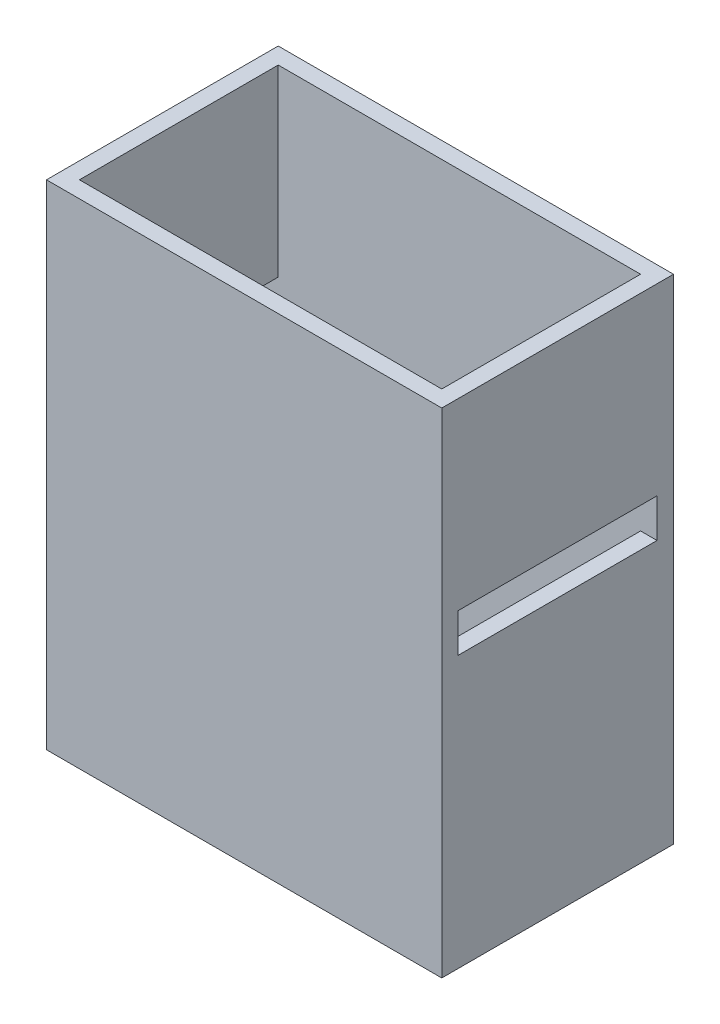
ISO-10303-21;
HEADER;
FILE_DESCRIPTION(('STEP AP214'),'2;1');
FILE_NAME('part.step','',(''),(''),'','','');
FILE_SCHEMA(('AUTOMOTIVE_DESIGN { 1 0 10303 214 1 1 1 1 }'));
ENDSEC;
DATA;
#1=APPLICATION_CONTEXT('core data for automotive mechanical design processes');
#2=APPLICATION_PROTOCOL_DEFINITION('international standard','automotive_design',2000,#1);
#3=PRODUCT_CONTEXT('',#1,'mechanical');
#4=PRODUCT('Part','Part','',(#3));
#5=PRODUCT_RELATED_PRODUCT_CATEGORY('part','',(#4));
#6=PRODUCT_DEFINITION_FORMATION('','',#4);
#7=PRODUCT_DEFINITION_CONTEXT('part definition',#1,'design');
#8=PRODUCT_DEFINITION('design','',#6,#7);
#9=PRODUCT_DEFINITION_SHAPE('','',#8);
#10=(LENGTH_UNIT() NAMED_UNIT(*) SI_UNIT(.MILLI.,.METRE.));
#11=(NAMED_UNIT(*) PLANE_ANGLE_UNIT() SI_UNIT($,.RADIAN.));
#12=(NAMED_UNIT(*) SI_UNIT($,.STERADIAN.) SOLID_ANGLE_UNIT());
#13=UNCERTAINTY_MEASURE_WITH_UNIT(LENGTH_MEASURE(1.E-05),#10,'distance_accuracy_value','');
#14=(GEOMETRIC_REPRESENTATION_CONTEXT(3) GLOBAL_UNCERTAINTY_ASSIGNED_CONTEXT((#13)) GLOBAL_UNIT_ASSIGNED_CONTEXT((#10,
#11,#12)) REPRESENTATION_CONTEXT('',''));
#15=CARTESIAN_POINT('',(0.,0.,0.));
#16=DIRECTION('',(0.,0.,1.));
#17=DIRECTION('',(1.,0.,0.));
#18=AXIS2_PLACEMENT_3D('',#15,#16,#17);
#19=CARTESIAN_POINT('',(23.,1.,-1.));
#20=DIRECTION('',(1.,0.,0.));
#21=DIRECTION('',(0.,0.,-1.));
#22=AXIS2_PLACEMENT_3D('',#19,#20,#21);
#23=PLANE('',#22);
#24=DIRECTION('',(0.,1.,0.));
#25=VECTOR('',#24,1.);
#26=CARTESIAN_POINT('',(23.,1.,-13.07));
#27=LINE('',#26,#25);
#28=CARTESIAN_POINT('',(23.,18.82,-13.07));
#29=VERTEX_POINT('',#28);
#30=CARTESIAN_POINT('',(23.,29.97,-13.07));
#31=VERTEX_POINT('',#30);
#32=EDGE_CURVE('E231',#29,#31,#27,.T.);
#33=ORIENTED_EDGE('',*,*,#32,.F.);
#34=DIRECTION('',(0.,0.,1.));
#35=VECTOR('',#34,1.);
#36=CARTESIAN_POINT('',(23.,18.82,-1.));
#37=LINE('',#36,#35);
#38=CARTESIAN_POINT('',(23.,18.82,-1.));
#39=VERTEX_POINT('',#38);
#40=EDGE_CURVE('E195',#29,#39,#37,.T.);
#41=ORIENTED_EDGE('',*,*,#40,.T.);
#42=DIRECTION('',(0.,1.,0.));
#43=VECTOR('',#42,1.);
#44=CARTESIAN_POINT('',(23.,1.,-1.));
#45=LINE('',#44,#43);
#46=CARTESIAN_POINT('',(23.,29.97,-1.));
#47=VERTEX_POINT('',#46);
#48=EDGE_CURVE('E235',#39,#47,#45,.T.);
#49=ORIENTED_EDGE('',*,*,#48,.T.);
#50=DIRECTION('',(0.,0.,-1.));
#51=VECTOR('',#50,1.);
#52=CARTESIAN_POINT('',(23.,29.97,-1.));
#53=LINE('',#52,#51);
#54=EDGE_CURVE('E209',#47,#31,#53,.T.);
#55=ORIENTED_EDGE('',*,*,#54,.T.);
#56=EDGE_LOOP('',(#33,#41,#49,#55));
#57=FACE_BOUND('',#56,.T.);
#58=ADVANCED_FACE('F39',(#57),#23,.F.);
#59=CARTESIAN_POINT('',(1.,1.,-13.07));
#60=DIRECTION('',(-1.,0.,0.));
#61=DIRECTION('',(0.,0.,1.));
#62=AXIS2_PLACEMENT_3D('',#59,#60,#61);
#63=PLANE('',#62);
#64=DIRECTION('',(0.,1.,0.));
#65=VECTOR('',#64,1.);
#66=CARTESIAN_POINT('',(1.,1.,-1.));
#67=LINE('',#66,#65);
#68=CARTESIAN_POINT('',(1.,18.82,-1.));
#69=VERTEX_POINT('',#68);
#70=CARTESIAN_POINT('',(1.,29.97,-1.));
#71=VERTEX_POINT('',#70);
#72=EDGE_CURVE('E239',#69,#71,#67,.T.);
#73=ORIENTED_EDGE('',*,*,#72,.F.);
#74=DIRECTION('',(0.,0.,-1.));
#75=VECTOR('',#74,1.);
#76=CARTESIAN_POINT('',(1.,18.82,-13.07));
#77=LINE('',#76,#75);
#78=CARTESIAN_POINT('',(1.,18.82,-13.07));
#79=VERTEX_POINT('',#78);
#80=EDGE_CURVE('E11',#69,#79,#77,.T.);
#81=ORIENTED_EDGE('',*,*,#80,.T.);
#82=DIRECTION('',(0.,1.,0.));
#83=VECTOR('',#82,1.);
#84=CARTESIAN_POINT('',(1.,1.,-13.07));
#85=LINE('',#84,#83);
#86=CARTESIAN_POINT('',(1.,29.97,-13.07));
#87=VERTEX_POINT('',#86);
#88=EDGE_CURVE('E218',#79,#87,#85,.T.);
#89=ORIENTED_EDGE('',*,*,#88,.T.);
#90=DIRECTION('',(0.,0.,1.));
#91=VECTOR('',#90,1.);
#92=CARTESIAN_POINT('',(1.,29.97,-13.07));
#93=LINE('',#92,#91);
#94=EDGE_CURVE('E221',#87,#71,#93,.T.);
#95=ORIENTED_EDGE('',*,*,#94,.T.);
#96=EDGE_LOOP('',(#73,#81,#89,#95));
#97=FACE_BOUND('',#96,.T.);
#98=ADVANCED_FACE('F299',(#97),#63,.F.);
#99=CARTESIAN_POINT('',(0.,29.97,0.));
#100=DIRECTION('',(1.,0.,0.));
#101=DIRECTION('',(0.,0.,-1.));
#102=AXIS2_PLACEMENT_3D('',#99,#100,#101);
#103=PLANE('',#102);
#104=DIRECTION('',(0.,0.,-1.));
#105=VECTOR('',#104,1.);
#106=CARTESIAN_POINT('',(0.,16.47,0.));
#107=LINE('',#106,#105);
#108=CARTESIAN_POINT('',(0.,16.47,-1.));
#109=VERTEX_POINT('',#108);
#110=CARTESIAN_POINT('',(0.,16.47,-13.07));
#111=VERTEX_POINT('',#110);
#112=EDGE_CURVE('E189',#109,#111,#107,.T.);
#113=ORIENTED_EDGE('',*,*,#112,.T.);
#114=DIRECTION('',(0.,1.,0.));
#115=VECTOR('',#114,1.);
#116=CARTESIAN_POINT('',(0.,29.97,-13.07));
#117=LINE('',#116,#115);
#118=CARTESIAN_POINT('',(0.,18.82,-13.07));
#119=VERTEX_POINT('',#118);
#120=EDGE_CURVE('E201',#111,#119,#117,.T.);
#121=ORIENTED_EDGE('',*,*,#120,.T.);
#122=DIRECTION('',(0.,0.,1.));
#123=VECTOR('',#122,1.);
#124=CARTESIAN_POINT('',(0.,18.82,0.));
#125=LINE('',#124,#123);
#126=CARTESIAN_POINT('',(0.,18.82,-1.));
#127=VERTEX_POINT('',#126);
#128=EDGE_CURVE('E198',#119,#127,#125,.T.);
#129=ORIENTED_EDGE('',*,*,#128,.T.);
#130=DIRECTION('',(0.,-1.,0.));
#131=VECTOR('',#130,1.);
#132=CARTESIAN_POINT('',(0.,29.97,-1.));
#133=LINE('',#132,#131);
#134=EDGE_CURVE('E192',#127,#109,#133,.T.);
#135=ORIENTED_EDGE('',*,*,#134,.T.);
#136=EDGE_LOOP('',(#113,#121,#129,#135));
#137=FACE_BOUND('',#136,.T.);
#138=DIRECTION('',(0.,0.,1.));
#139=VECTOR('',#138,1.);
#140=CARTESIAN_POINT('',(0.,0.,0.));
#141=LINE('',#140,#139);
#142=CARTESIAN_POINT('',(0.,0.,-14.07));
#143=VERTEX_POINT('',#142);
#144=CARTESIAN_POINT('',(0.,0.,0.));
#145=VERTEX_POINT('',#144);
#146=EDGE_CURVE('E230',#143,#145,#141,.T.);
#147=ORIENTED_EDGE('',*,*,#146,.T.);
#148=DIRECTION('',(0.,-1.,0.));
#149=VECTOR('',#148,1.);
#150=CARTESIAN_POINT('',(0.,29.97,0.));
#151=LINE('',#150,#149);
#152=CARTESIAN_POINT('',(0.,29.97,0.));
#153=VERTEX_POINT('',#152);
#154=EDGE_CURVE('E269',#153,#145,#151,.T.);
#155=ORIENTED_EDGE('',*,*,#154,.F.);
#156=DIRECTION('',(0.,0.,1.));
#157=VECTOR('',#156,1.);
#158=CARTESIAN_POINT('',(0.,29.97,0.));
#159=LINE('',#158,#157);
#160=CARTESIAN_POINT('',(0.,29.97,-14.07));
#161=VERTEX_POINT('',#160);
#162=EDGE_CURVE('E243',#161,#153,#159,.T.);
#163=ORIENTED_EDGE('',*,*,#162,.F.);
#164=DIRECTION('',(0.,-1.,0.));
#165=VECTOR('',#164,1.);
#166=CARTESIAN_POINT('',(0.,29.97,-14.07));
#167=LINE('',#166,#165);
#168=EDGE_CURVE('E253',#161,#143,#167,.T.);
#169=ORIENTED_EDGE('',*,*,#168,.T.);
#170=EDGE_LOOP('',(#147,#155,#163,#169));
#171=FACE_BOUND('',#170,.T.);
#172=ADVANCED_FACE('F41',(#137,#171),#103,.F.);
#173=CARTESIAN_POINT('',(0.,29.97,0.));
#174=DIRECTION('',(0.,0.,-1.));
#175=DIRECTION('',(-1.,0.,0.));
#176=AXIS2_PLACEMENT_3D('',#173,#174,#175);
#177=PLANE('',#176);
#178=DIRECTION('',(1.,0.,0.));
#179=VECTOR('',#178,1.);
#180=CARTESIAN_POINT('',(0.,0.,0.));
#181=LINE('',#180,#179);
#182=CARTESIAN_POINT('',(24.,0.,0.));
#183=VERTEX_POINT('',#182);
#184=EDGE_CURVE('E256',#145,#183,#181,.T.);
#185=ORIENTED_EDGE('',*,*,#184,.T.);
#186=DIRECTION('',(0.,-1.,0.));
#187=VECTOR('',#186,1.);
#188=CARTESIAN_POINT('',(24.,29.97,0.));
#189=LINE('',#188,#187);
#190=CARTESIAN_POINT('',(24.,29.97,0.));
#191=VERTEX_POINT('',#190);
#192=EDGE_CURVE('E266',#191,#183,#189,.T.);
#193=ORIENTED_EDGE('',*,*,#192,.F.);
#194=DIRECTION('',(1.,0.,0.));
#195=VECTOR('',#194,1.);
#196=CARTESIAN_POINT('',(0.,29.97,0.));
#197=LINE('',#196,#195);
#198=EDGE_CURVE('E246',#153,#191,#197,.T.);
#199=ORIENTED_EDGE('',*,*,#198,.F.);
#200=ORIENTED_EDGE('',*,*,#154,.T.);
#201=EDGE_LOOP('',(#185,#193,#199,#200));
#202=FACE_BOUND('',#201,.T.);
#203=ADVANCED_FACE('F333',(#202),#177,.F.);
#204=CARTESIAN_POINT('',(24.,29.97,0.));
#205=DIRECTION('',(-1.,0.,0.));
#206=DIRECTION('',(0.,0.,1.));
#207=AXIS2_PLACEMENT_3D('',#204,#205,#206);
#208=PLANE('',#207);
#209=DIRECTION('',(0.,0.,-1.));
#210=VECTOR('',#209,1.);
#211=CARTESIAN_POINT('',(24.,18.82,-13.07));
#212=LINE('',#211,#210);
#213=CARTESIAN_POINT('',(24.,18.82,-1.));
#214=VERTEX_POINT('',#213);
#215=CARTESIAN_POINT('',(24.,18.82,-13.07));
#216=VERTEX_POINT('',#215);
#217=EDGE_CURVE('E175',#214,#216,#212,.T.);
#218=ORIENTED_EDGE('',*,*,#217,.T.);
#219=DIRECTION('',(0.,-1.,0.));
#220=VECTOR('',#219,1.);
#221=CARTESIAN_POINT('',(24.,16.47,-13.07));
#222=LINE('',#221,#220);
#223=CARTESIAN_POINT('',(24.,16.47,-13.07));
#224=VERTEX_POINT('',#223);
#225=EDGE_CURVE('E158',#216,#224,#222,.T.);
#226=ORIENTED_EDGE('',*,*,#225,.T.);
#227=DIRECTION('',(0.,0.,1.));
#228=VECTOR('',#227,1.);
#229=CARTESIAN_POINT('',(24.,16.47,-1.));
#230=LINE('',#229,#228);
#231=CARTESIAN_POINT('',(24.,16.47,-1.));
#232=VERTEX_POINT('',#231);
#233=EDGE_CURVE('E167',#224,#232,#230,.T.);
#234=ORIENTED_EDGE('',*,*,#233,.T.);
#235=DIRECTION('',(0.,1.,0.));
#236=VECTOR('',#235,1.);
#237=CARTESIAN_POINT('',(24.,18.82,-1.));
#238=LINE('',#237,#236);
#239=EDGE_CURVE('E62',#232,#214,#238,.T.);
#240=ORIENTED_EDGE('',*,*,#239,.T.);
#241=EDGE_LOOP('',(#218,#226,#234,#240));
#242=FACE_BOUND('',#241,.T.);
#243=DIRECTION('',(0.,0.,-1.));
#244=VECTOR('',#243,1.);
#245=CARTESIAN_POINT('',(24.,0.,0.));
#246=LINE('',#245,#244);
#247=CARTESIAN_POINT('',(24.,0.,-14.07));
#248=VERTEX_POINT('',#247);
#249=EDGE_CURVE('E258',#183,#248,#246,.T.);
#250=ORIENTED_EDGE('',*,*,#249,.T.);
#251=DIRECTION('',(0.,-1.,0.));
#252=VECTOR('',#251,1.);
#253=CARTESIAN_POINT('',(24.,29.97,-14.07));
#254=LINE('',#253,#252);
#255=CARTESIAN_POINT('',(24.,29.97,-14.07));
#256=VERTEX_POINT('',#255);
#257=EDGE_CURVE('E263',#256,#248,#254,.T.);
#258=ORIENTED_EDGE('',*,*,#257,.F.);
#259=DIRECTION('',(0.,0.,-1.));
#260=VECTOR('',#259,1.);
#261=CARTESIAN_POINT('',(24.,29.97,0.));
#262=LINE('',#261,#260);
#263=EDGE_CURVE('E249',#191,#256,#262,.T.);
#264=ORIENTED_EDGE('',*,*,#263,.F.);
#265=ORIENTED_EDGE('',*,*,#192,.T.);
#266=EDGE_LOOP('',(#250,#258,#264,#265));
#267=FACE_BOUND('',#266,.T.);
#268=ADVANCED_FACE('F172',(#242,#267),#208,.F.);
#269=CARTESIAN_POINT('',(0.,29.97,-14.07));
#270=DIRECTION('',(0.,0.,1.));
#271=DIRECTION('',(1.,0.,0.));
#272=AXIS2_PLACEMENT_3D('',#269,#270,#271);
#273=PLANE('',#272);
#274=DIRECTION('',(-1.,0.,0.));
#275=VECTOR('',#274,1.);
#276=CARTESIAN_POINT('',(0.,0.,-14.07));
#277=LINE('',#276,#275);
#278=EDGE_CURVE('E247',#248,#143,#277,.T.);
#279=ORIENTED_EDGE('',*,*,#278,.T.);
#280=ORIENTED_EDGE('',*,*,#168,.F.);
#281=DIRECTION('',(-1.,0.,0.));
#282=VECTOR('',#281,1.);
#283=CARTESIAN_POINT('',(0.,29.97,-14.07));
#284=LINE('',#283,#282);
#285=EDGE_CURVE('E251',#256,#161,#284,.T.);
#286=ORIENTED_EDGE('',*,*,#285,.F.);
#287=ORIENTED_EDGE('',*,*,#257,.T.);
#288=EDGE_LOOP('',(#279,#280,#286,#287));
#289=FACE_BOUND('',#288,.T.);
#290=ADVANCED_FACE('F326',(#289),#273,.F.);
#291=CARTESIAN_POINT('',(0.,29.97,0.));
#292=DIRECTION('',(0.,-1.,0.));
#293=DIRECTION('',(0.,0.,-1.));
#294=AXIS2_PLACEMENT_3D('',#291,#292,#293);
#295=PLANE('',#294);
#296=ORIENTED_EDGE('',*,*,#94,.F.);
#297=DIRECTION('',(-1.,0.,0.));
#298=VECTOR('',#297,1.);
#299=CARTESIAN_POINT('',(23.,29.97,-13.07));
#300=LINE('',#299,#298);
#301=EDGE_CURVE('E204',#31,#87,#300,.T.);
#302=ORIENTED_EDGE('',*,*,#301,.F.);
#303=ORIENTED_EDGE('',*,*,#54,.F.);
#304=DIRECTION('',(1.,0.,0.));
#305=VECTOR('',#304,1.);
#306=CARTESIAN_POINT('',(1.,29.97,-1.));
#307=LINE('',#306,#305);
#308=EDGE_CURVE('E224',#71,#47,#307,.T.);
#309=ORIENTED_EDGE('',*,*,#308,.F.);
#310=EDGE_LOOP('',(#296,#302,#303,#309));
#311=FACE_BOUND('',#310,.T.);
#312=ORIENTED_EDGE('',*,*,#162,.T.);
#313=ORIENTED_EDGE('',*,*,#198,.T.);
#314=ORIENTED_EDGE('',*,*,#263,.T.);
#315=ORIENTED_EDGE('',*,*,#285,.T.);
#316=EDGE_LOOP('',(#312,#313,#314,#315));
#317=FACE_BOUND('',#316,.T.);
#318=ADVANCED_FACE('F321',(#311,#317),#295,.F.);
#319=CARTESIAN_POINT('',(0.,0.,0.));
#320=DIRECTION('',(0.,-1.,0.));
#321=DIRECTION('',(0.,0.,-1.));
#322=AXIS2_PLACEMENT_3D('',#319,#320,#321);
#323=PLANE('',#322);
#324=ORIENTED_EDGE('',*,*,#146,.F.);
#325=ORIENTED_EDGE('',*,*,#278,.F.);
#326=ORIENTED_EDGE('',*,*,#249,.F.);
#327=ORIENTED_EDGE('',*,*,#184,.F.);
#328=EDGE_LOOP('',(#324,#325,#326,#327));
#329=FACE_BOUND('',#328,.T.);
#330=ADVANCED_FACE('F316',(#329),#323,.T.);
#331=CARTESIAN_POINT('',(23.,1.,-13.07));
#332=DIRECTION('',(0.,0.,-1.));
#333=DIRECTION('',(-1.,0.,0.));
#334=AXIS2_PLACEMENT_3D('',#331,#332,#333);
#335=PLANE('',#334);
#336=CARTESIAN_POINT('',(23.,1.,-13.07));
#337=VERTEX_POINT('',#336);
#338=CARTESIAN_POINT('',(23.,16.47,-13.07));
#339=VERTEX_POINT('',#338);
#340=EDGE_CURVE('E161',#337,#339,#27,.T.);
#341=ORIENTED_EDGE('',*,*,#340,.T.);
#342=DIRECTION('',(-1.,0.,0.));
#343=VECTOR('',#342,1.);
#344=CARTESIAN_POINT('',(24.,16.47,-13.07));
#345=LINE('',#344,#343);
#346=EDGE_CURVE('E153',#224,#339,#345,.T.);
#347=ORIENTED_EDGE('',*,*,#346,.F.);
#348=ORIENTED_EDGE('',*,*,#225,.F.);
#349=DIRECTION('',(-1.,0.,0.));
#350=VECTOR('',#349,1.);
#351=CARTESIAN_POINT('',(24.,18.82,-13.07));
#352=LINE('',#351,#350);
#353=EDGE_CURVE('E180',#216,#29,#352,.T.);
#354=ORIENTED_EDGE('',*,*,#353,.T.);
#355=ORIENTED_EDGE('',*,*,#32,.T.);
#356=ORIENTED_EDGE('',*,*,#301,.T.);
#357=ORIENTED_EDGE('',*,*,#88,.F.);
#358=EDGE_CURVE('E183',#79,#119,#352,.T.);
#359=ORIENTED_EDGE('',*,*,#358,.T.);
#360=ORIENTED_EDGE('',*,*,#120,.F.);
#361=CARTESIAN_POINT('',(1.,16.47,-13.07));
#362=VERTEX_POINT('',#361);
#363=EDGE_CURVE('E54',#362,#111,#345,.T.);
#364=ORIENTED_EDGE('',*,*,#363,.F.);
#365=CARTESIAN_POINT('',(1.,1.,-13.07));
#366=VERTEX_POINT('',#365);
#367=EDGE_CURVE('E240',#366,#362,#85,.T.);
#368=ORIENTED_EDGE('',*,*,#367,.F.);
#369=DIRECTION('',(-1.,0.,0.));
#370=VECTOR('',#369,1.);
#371=CARTESIAN_POINT('',(23.,1.,-13.07));
#372=LINE('',#371,#370);
#373=EDGE_CURVE('E205',#337,#366,#372,.T.);
#374=ORIENTED_EDGE('',*,*,#373,.F.);
#375=EDGE_LOOP('',(#341,#347,#348,#354,#355,#356,#357,#359,#360,#364,#368,#374));
#376=FACE_BOUND('',#375,.T.);
#377=ADVANCED_FACE('F155',(#376),#335,.F.);
#378=CARTESIAN_POINT('',(23.,1.,-1.));
#379=VERTEX_POINT('',#378);
#380=CARTESIAN_POINT('',(23.,16.47,-1.));
#381=VERTEX_POINT('',#380);
#382=EDGE_CURVE('E232',#379,#381,#45,.T.);
#383=ORIENTED_EDGE('',*,*,#382,.T.);
#384=DIRECTION('',(0.,0.,-1.));
#385=VECTOR('',#384,1.);
#386=CARTESIAN_POINT('',(23.,16.47,-1.));
#387=LINE('',#386,#385);
#388=EDGE_CURVE('E182',#381,#339,#387,.T.);
#389=ORIENTED_EDGE('',*,*,#388,.T.);
#390=ORIENTED_EDGE('',*,*,#340,.F.);
#391=DIRECTION('',(0.,0.,-1.));
#392=VECTOR('',#391,1.);
#393=CARTESIAN_POINT('',(23.,1.,-1.));
#394=LINE('',#393,#392);
#395=EDGE_CURVE('E215',#379,#337,#394,.T.);
#396=ORIENTED_EDGE('',*,*,#395,.F.);
#397=EDGE_LOOP('',(#383,#389,#390,#396));
#398=FACE_BOUND('',#397,.T.);
#399=ADVANCED_FACE('F302',(#398),#23,.F.);
#400=CARTESIAN_POINT('',(1.,1.,-1.));
#401=DIRECTION('',(0.,0.,1.));
#402=DIRECTION('',(1.,0.,0.));
#403=AXIS2_PLACEMENT_3D('',#400,#401,#402);
#404=PLANE('',#403);
#405=CARTESIAN_POINT('',(1.,1.,-1.));
#406=VERTEX_POINT('',#405);
#407=CARTESIAN_POINT('',(1.,16.47,-1.));
#408=VERTEX_POINT('',#407);
#409=EDGE_CURVE('E236',#406,#408,#67,.T.);
#410=ORIENTED_EDGE('',*,*,#409,.T.);
#411=DIRECTION('',(-1.,0.,0.));
#412=VECTOR('',#411,1.);
#413=CARTESIAN_POINT('',(24.,16.47,-1.));
#414=LINE('',#413,#412);
#415=EDGE_CURVE('E164',#408,#109,#414,.T.);
#416=ORIENTED_EDGE('',*,*,#415,.T.);
#417=ORIENTED_EDGE('',*,*,#134,.F.);
#418=DIRECTION('',(-1.,0.,0.));
#419=VECTOR('',#418,1.);
#420=CARTESIAN_POINT('',(24.,18.82,-1.));
#421=LINE('',#420,#419);
#422=EDGE_CURVE('E186',#69,#127,#421,.T.);
#423=ORIENTED_EDGE('',*,*,#422,.F.);
#424=ORIENTED_EDGE('',*,*,#72,.T.);
#425=ORIENTED_EDGE('',*,*,#308,.T.);
#426=ORIENTED_EDGE('',*,*,#48,.F.);
#427=EDGE_CURVE('E184',#214,#39,#421,.T.);
#428=ORIENTED_EDGE('',*,*,#427,.F.);
#429=ORIENTED_EDGE('',*,*,#239,.F.);
#430=EDGE_CURVE('E169',#232,#381,#414,.T.);
#431=ORIENTED_EDGE('',*,*,#430,.T.);
#432=ORIENTED_EDGE('',*,*,#382,.F.);
#433=DIRECTION('',(1.,0.,0.));
#434=VECTOR('',#433,1.);
#435=CARTESIAN_POINT('',(1.,1.,-1.));
#436=LINE('',#435,#434);
#437=EDGE_CURVE('E212',#406,#379,#436,.T.);
#438=ORIENTED_EDGE('',*,*,#437,.F.);
#439=EDGE_LOOP('',(#410,#416,#417,#423,#424,#425,#426,#428,#429,#431,#432,#438));
#440=FACE_BOUND('',#439,.T.);
#441=ADVANCED_FACE('F277',(#440),#404,.F.);
#442=ORIENTED_EDGE('',*,*,#367,.T.);
#443=DIRECTION('',(0.,0.,1.));
#444=VECTOR('',#443,1.);
#445=CARTESIAN_POINT('',(1.,16.47,-13.07));
#446=LINE('',#445,#444);
#447=EDGE_CURVE('E47',#362,#408,#446,.T.);
#448=ORIENTED_EDGE('',*,*,#447,.T.);
#449=ORIENTED_EDGE('',*,*,#409,.F.);
#450=DIRECTION('',(0.,0.,1.));
#451=VECTOR('',#450,1.);
#452=CARTESIAN_POINT('',(1.,1.,-13.07));
#453=LINE('',#452,#451);
#454=EDGE_CURVE('E208',#366,#406,#453,.T.);
#455=ORIENTED_EDGE('',*,*,#454,.F.);
#456=EDGE_LOOP('',(#442,#448,#449,#455));
#457=FACE_BOUND('',#456,.T.);
#458=ADVANCED_FACE('F273',(#457),#63,.F.);
#459=CARTESIAN_POINT('',(0.,1.,0.));
#460=DIRECTION('',(0.,1.,0.));
#461=DIRECTION('',(0.,0.,1.));
#462=AXIS2_PLACEMENT_3D('',#459,#460,#461);
#463=PLANE('',#462);
#464=ORIENTED_EDGE('',*,*,#373,.T.);
#465=ORIENTED_EDGE('',*,*,#454,.T.);
#466=ORIENTED_EDGE('',*,*,#437,.T.);
#467=ORIENTED_EDGE('',*,*,#395,.T.);
#468=EDGE_LOOP('',(#464,#465,#466,#467));
#469=FACE_BOUND('',#468,.T.);
#470=ADVANCED_FACE('F280',(#469),#463,.T.);
#471=CARTESIAN_POINT('',(24.,16.47,-1.));
#472=DIRECTION('',(0.,-1.,0.));
#473=DIRECTION('',(0.,0.,-1.));
#474=AXIS2_PLACEMENT_3D('',#471,#472,#473);
#475=PLANE('',#474);
#476=ORIENTED_EDGE('',*,*,#415,.F.);
#477=ORIENTED_EDGE('',*,*,#447,.F.);
#478=ORIENTED_EDGE('',*,*,#363,.T.);
#479=ORIENTED_EDGE('',*,*,#112,.F.);
#480=EDGE_LOOP('',(#476,#477,#478,#479));
#481=FACE_BOUND('',#480,.T.);
#482=ADVANCED_FACE('F285',(#481),#475,.F.);
#483=CARTESIAN_POINT('',(24.,18.82,-13.07));
#484=DIRECTION('',(0.,1.,0.));
#485=DIRECTION('',(0.,0.,1.));
#486=AXIS2_PLACEMENT_3D('',#483,#484,#485);
#487=PLANE('',#486);
#488=ORIENTED_EDGE('',*,*,#358,.F.);
#489=ORIENTED_EDGE('',*,*,#80,.F.);
#490=ORIENTED_EDGE('',*,*,#422,.T.);
#491=ORIENTED_EDGE('',*,*,#128,.F.);
#492=EDGE_LOOP('',(#488,#489,#490,#491));
#493=FACE_BOUND('',#492,.T.);
#494=ADVANCED_FACE('F287',(#493),#487,.F.);
#495=ORIENTED_EDGE('',*,*,#353,.F.);
#496=ORIENTED_EDGE('',*,*,#217,.F.);
#497=ORIENTED_EDGE('',*,*,#427,.T.);
#498=ORIENTED_EDGE('',*,*,#40,.F.);
#499=EDGE_LOOP('',(#495,#496,#497,#498));
#500=FACE_BOUND('',#499,.T.);
#501=ADVANCED_FACE('F293',(#500),#487,.F.);
#502=ORIENTED_EDGE('',*,*,#430,.F.);
#503=ORIENTED_EDGE('',*,*,#233,.F.);
#504=ORIENTED_EDGE('',*,*,#346,.T.);
#505=ORIENTED_EDGE('',*,*,#388,.F.);
#506=EDGE_LOOP('',(#502,#503,#504,#505));
#507=FACE_BOUND('',#506,.T.);
#508=ADVANCED_FACE('F168',(#507),#475,.F.);
#509=CLOSED_SHELL('',(#58,#98,#172,#203,#268,#290,#318,#330,#377,#399,#441,#458,#470,#482,#494,
#501,#508));
#510=MANIFOLD_SOLID_BREP('B2',#509);
#511=ADVANCED_BREP_SHAPE_REPRESENTATION('',(#18,#510),#14);
#512=SHAPE_DEFINITION_REPRESENTATION(#9,#511);
ENDSEC;
END-ISO-10303-21;
